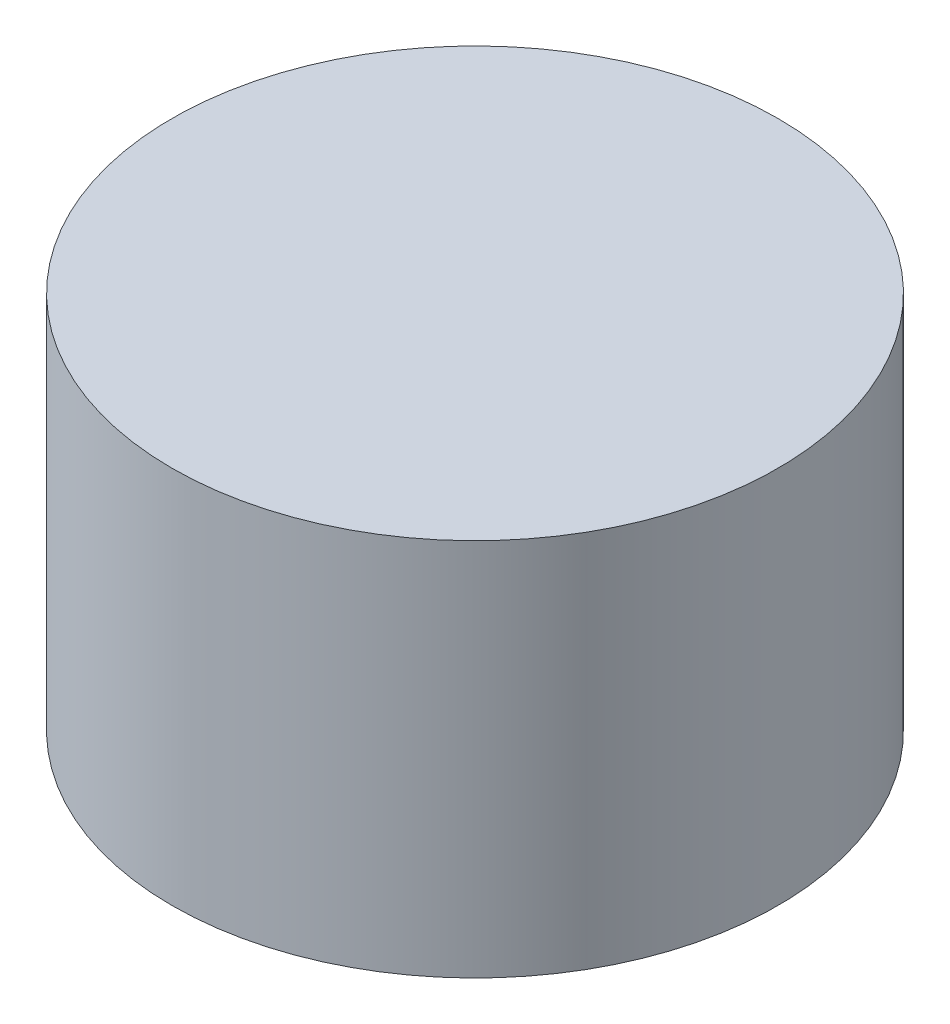
ISO-10303-21;
HEADER;
FILE_DESCRIPTION(('STEP AP214'),'2;1');
FILE_NAME('part.step','',(''),(''),'','','');
FILE_SCHEMA(('AUTOMOTIVE_DESIGN { 1 0 10303 214 1 1 1 1 }'));
ENDSEC;
DATA;
#1=APPLICATION_CONTEXT('core data for automotive mechanical design processes');
#2=APPLICATION_PROTOCOL_DEFINITION('international standard','automotive_design',2000,#1);
#3=PRODUCT_CONTEXT('',#1,'mechanical');
#4=PRODUCT('Part','Part','',(#3));
#5=PRODUCT_RELATED_PRODUCT_CATEGORY('part','',(#4));
#6=PRODUCT_DEFINITION_FORMATION('','',#4);
#7=PRODUCT_DEFINITION_CONTEXT('part definition',#1,'design');
#8=PRODUCT_DEFINITION('design','',#6,#7);
#9=PRODUCT_DEFINITION_SHAPE('','',#8);
#10=(LENGTH_UNIT() NAMED_UNIT(*) SI_UNIT(.MILLI.,.METRE.));
#11=(NAMED_UNIT(*) PLANE_ANGLE_UNIT() SI_UNIT($,.RADIAN.));
#12=(NAMED_UNIT(*) SI_UNIT($,.STERADIAN.) SOLID_ANGLE_UNIT());
#13=UNCERTAINTY_MEASURE_WITH_UNIT(LENGTH_MEASURE(1.E-05),#10,'distance_accuracy_value','');
#14=(GEOMETRIC_REPRESENTATION_CONTEXT(3) GLOBAL_UNCERTAINTY_ASSIGNED_CONTEXT((#13)) GLOBAL_UNIT_ASSIGNED_CONTEXT((#10,
#11,#12)) REPRESENTATION_CONTEXT('',''));
#15=CARTESIAN_POINT('',(0.,0.,0.));
#16=DIRECTION('',(0.,0.,1.));
#17=DIRECTION('',(1.,0.,0.));
#18=AXIS2_PLACEMENT_3D('',#15,#16,#17);
#19=CARTESIAN_POINT('',(0.,20.,0.));
#20=DIRECTION('',(0.,-1.,0.));
#21=DIRECTION('',(0.,0.,-1.));
#22=AXIS2_PLACEMENT_3D('',#19,#20,#21);
#23=CYLINDRICAL_SURFACE('',#22,16.);
#24=CARTESIAN_POINT('',(0.,20.,0.));
#25=DIRECTION('',(0.,1.,0.));
#26=DIRECTION('',(0.,0.,1.));
#27=AXIS2_PLACEMENT_3D('',#24,#25,#26);
#28=CIRCLE('',#27,16.);
#29=CARTESIAN_POINT('',(0.,20.,16.));
#30=VERTEX_POINT('',#29);
#31=EDGE_CURVE('E40',#30,#30,#28,.T.);
#32=ORIENTED_EDGE('',*,*,#31,.F.);
#33=EDGE_LOOP('',(#32));
#34=FACE_BOUND('',#33,.T.);
#35=CARTESIAN_POINT('',(0.,0.,0.));
#36=DIRECTION('',(0.,1.,0.));
#37=DIRECTION('',(0.,0.,1.));
#38=AXIS2_PLACEMENT_3D('',#35,#36,#37);
#39=CIRCLE('',#38,16.);
#40=CARTESIAN_POINT('',(0.,0.,16.));
#41=VERTEX_POINT('',#40);
#42=EDGE_CURVE('E44',#41,#41,#39,.T.);
#43=ORIENTED_EDGE('',*,*,#42,.T.);
#44=EDGE_LOOP('',(#43));
#45=FACE_BOUND('',#44,.T.);
#46=ADVANCED_FACE('F34',(#34,#45),#23,.T.);
#47=CARTESIAN_POINT('',(0.,20.,0.));
#48=DIRECTION('',(0.,1.,0.));
#49=DIRECTION('',(0.,0.,1.));
#50=AXIS2_PLACEMENT_3D('',#47,#48,#49);
#51=PLANE('',#50);
#52=ORIENTED_EDGE('',*,*,#31,.T.);
#53=EDGE_LOOP('',(#52));
#54=FACE_BOUND('',#53,.T.);
#55=ADVANCED_FACE('F75',(#54),#51,.T.);
#56=CARTESIAN_POINT('',(0.,0.,0.));
#57=DIRECTION('',(0.,1.,0.));
#58=DIRECTION('',(0.,0.,1.));
#59=AXIS2_PLACEMENT_3D('',#56,#57,#58);
#60=PLANE('',#59);
#61=CARTESIAN_POINT('',(0.,0.,0.));
#62=DIRECTION('',(0.,1.,0.));
#63=DIRECTION('',(0.,0.,1.));
#64=AXIS2_PLACEMENT_3D('',#61,#62,#63);
#65=CIRCLE('',#64,15.);
#66=CARTESIAN_POINT('',(0.,0.,15.));
#67=VERTEX_POINT('',#66);
#68=EDGE_CURVE('E49',#67,#67,#65,.T.);
#69=ORIENTED_EDGE('',*,*,#68,.T.);
#70=EDGE_LOOP('',(#69));
#71=FACE_BOUND('',#70,.T.);
#72=ORIENTED_EDGE('',*,*,#42,.F.);
#73=EDGE_LOOP('',(#72));
#74=FACE_BOUND('',#73,.T.);
#75=ADVANCED_FACE('F80',(#71,#74),#60,.F.);
#76=CARTESIAN_POINT('',(0.,0.,0.));
#77=DIRECTION('',(0.,1.,0.));
#78=DIRECTION('',(0.,0.,1.));
#79=AXIS2_PLACEMENT_3D('',#76,#77,#78);
#80=CYLINDRICAL_SURFACE('',#79,15.);
#81=ORIENTED_EDGE('',*,*,#68,.F.);
#82=EDGE_LOOP('',(#81));
#83=FACE_BOUND('',#82,.T.);
#84=CARTESIAN_POINT('',(0.,18.,0.));
#85=DIRECTION('',(0.,1.,0.));
#86=DIRECTION('',(0.,0.,1.));
#87=AXIS2_PLACEMENT_3D('',#84,#85,#86);
#88=CIRCLE('',#87,15.);
#89=CARTESIAN_POINT('',(0.,18.,15.));
#90=VERTEX_POINT('',#89);
#91=EDGE_CURVE('E51',#90,#90,#88,.T.);
#92=ORIENTED_EDGE('',*,*,#91,.T.);
#93=EDGE_LOOP('',(#92));
#94=FACE_BOUND('',#93,.T.);
#95=ADVANCED_FACE('F71',(#83,#94),#80,.F.);
#96=CARTESIAN_POINT('',(0.,18.,0.));
#97=DIRECTION('',(0.,1.,0.));
#98=DIRECTION('',(0.,0.,1.));
#99=AXIS2_PLACEMENT_3D('',#96,#97,#98);
#100=PLANE('',#99);
#101=CARTESIAN_POINT('',(0.,18.,0.));
#102=DIRECTION('',(0.,1.,0.));
#103=DIRECTION('',(0.,0.,1.));
#104=AXIS2_PLACEMENT_3D('',#101,#102,#103);
#105=CIRCLE('',#104,3.);
#106=CARTESIAN_POINT('',(0.,18.,3.));
#107=VERTEX_POINT('',#106);
#108=EDGE_CURVE('E10',#107,#107,#105,.F.);
#109=ORIENTED_EDGE('',*,*,#108,.F.);
#110=EDGE_LOOP('',(#109));
#111=FACE_BOUND('',#110,.T.);
#112=ORIENTED_EDGE('',*,*,#91,.F.);
#113=EDGE_LOOP('',(#112));
#114=FACE_BOUND('',#113,.T.);
#115=ADVANCED_FACE('F64',(#111,#114),#100,.F.);
#116=CARTESIAN_POINT('',(0.,17.,0.));
#117=DIRECTION('',(0.,1.,0.));
#118=DIRECTION('',(0.,0.,1.));
#119=AXIS2_PLACEMENT_3D('',#116,#117,#118);
#120=CYLINDRICAL_SURFACE('',#119,3.);
#121=CARTESIAN_POINT('',(0.,17.,0.));
#122=DIRECTION('',(0.,-1.,0.));
#123=DIRECTION('',(0.,0.,-1.));
#124=AXIS2_PLACEMENT_3D('',#121,#122,#123);
#125=CIRCLE('',#124,3.);
#126=CARTESIAN_POINT('',(0.,17.,-3.));
#127=VERTEX_POINT('',#126);
#128=EDGE_CURVE('E54',#127,#127,#125,.T.);
#129=ORIENTED_EDGE('',*,*,#128,.F.);
#130=EDGE_LOOP('',(#129));
#131=FACE_BOUND('',#130,.T.);
#132=ORIENTED_EDGE('',*,*,#108,.T.);
#133=EDGE_LOOP('',(#132));
#134=FACE_BOUND('',#133,.T.);
#135=ADVANCED_FACE('F62',(#131,#134),#120,.T.);
#136=CARTESIAN_POINT('',(0.,17.,0.));
#137=DIRECTION('',(0.,-1.,0.));
#138=DIRECTION('',(0.,0.,-1.));
#139=AXIS2_PLACEMENT_3D('',#136,#137,#138);
#140=PLANE('',#139);
#141=ORIENTED_EDGE('',*,*,#128,.T.);
#142=EDGE_LOOP('',(#141));
#143=FACE_BOUND('',#142,.T.);
#144=ADVANCED_FACE('F60',(#143),#140,.T.);
#145=CLOSED_SHELL('',(#46,#55,#75,#95,#115,#135,#144));
#146=MANIFOLD_SOLID_BREP('B2',#145);
#147=ADVANCED_BREP_SHAPE_REPRESENTATION('',(#18,#146),#14);
#148=SHAPE_DEFINITION_REPRESENTATION(#9,#147);
ENDSEC;
END-ISO-10303-21;
